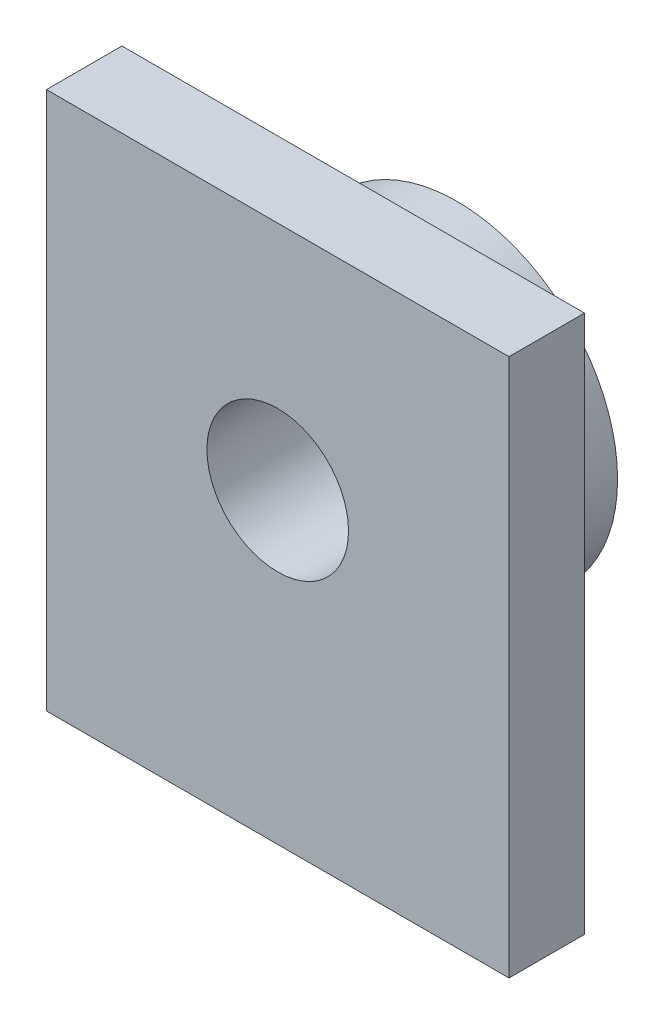
ISO-10303-21;
HEADER;
FILE_DESCRIPTION(('STEP AP214'),'2;1');
FILE_NAME('part.step','',(''),(''),'','','');
FILE_SCHEMA(('AUTOMOTIVE_DESIGN { 1 0 10303 214 1 1 1 1 }'));
ENDSEC;
DATA;
#1=APPLICATION_CONTEXT('core data for automotive mechanical design processes');
#2=APPLICATION_PROTOCOL_DEFINITION('international standard','automotive_design',2000,#1);
#3=PRODUCT_CONTEXT('',#1,'mechanical');
#4=PRODUCT('Part','Part','',(#3));
#5=PRODUCT_RELATED_PRODUCT_CATEGORY('part','',(#4));
#6=PRODUCT_DEFINITION_FORMATION('','',#4);
#7=PRODUCT_DEFINITION_CONTEXT('part definition',#1,'design');
#8=PRODUCT_DEFINITION('design','',#6,#7);
#9=PRODUCT_DEFINITION_SHAPE('','',#8);
#10=(LENGTH_UNIT() NAMED_UNIT(*) SI_UNIT(.MILLI.,.METRE.));
#11=(NAMED_UNIT(*) PLANE_ANGLE_UNIT() SI_UNIT($,.RADIAN.));
#12=(NAMED_UNIT(*) SI_UNIT($,.STERADIAN.) SOLID_ANGLE_UNIT());
#13=UNCERTAINTY_MEASURE_WITH_UNIT(LENGTH_MEASURE(1.E-05),#10,'distance_accuracy_value','');
#14=(GEOMETRIC_REPRESENTATION_CONTEXT(3) GLOBAL_UNCERTAINTY_ASSIGNED_CONTEXT((#13)) GLOBAL_UNIT_ASSIGNED_CONTEXT((#10,
#11,#12)) REPRESENTATION_CONTEXT('',''));
#15=CARTESIAN_POINT('',(0.,0.,0.));
#16=DIRECTION('',(0.,0.,1.));
#17=DIRECTION('',(1.,0.,0.));
#18=AXIS2_PLACEMENT_3D('',#15,#16,#17);
#19=CARTESIAN_POINT('',(0.,0.,1.6));
#20=DIRECTION('',(0.,0.,1.));
#21=DIRECTION('',(1.,0.,0.));
#22=AXIS2_PLACEMENT_3D('',#19,#20,#21);
#23=PLANE('',#22);
#24=DIRECTION('',(0.,-1.,0.));
#25=VECTOR('',#24,1.);
#26=CARTESIAN_POINT('',(-4.9,4.9,1.6));
#27=LINE('',#26,#25);
#28=CARTESIAN_POINT('',(-4.9,4.9,1.6));
#29=VERTEX_POINT('',#28);
#30=CARTESIAN_POINT('',(-4.9,-6.5,1.6));
#31=VERTEX_POINT('',#30);
#32=EDGE_CURVE('E89',#29,#31,#27,.T.);
#33=ORIENTED_EDGE('',*,*,#32,.T.);
#34=DIRECTION('',(1.,0.,0.));
#35=VECTOR('',#34,1.);
#36=CARTESIAN_POINT('',(-4.9,-6.5,1.6));
#37=LINE('',#36,#35);
#38=CARTESIAN_POINT('',(4.9,-6.5,1.6));
#39=VERTEX_POINT('',#38);
#40=EDGE_CURVE('E84',#31,#39,#37,.T.);
#41=ORIENTED_EDGE('',*,*,#40,.T.);
#42=DIRECTION('',(0.,1.,0.));
#43=VECTOR('',#42,1.);
#44=CARTESIAN_POINT('',(4.9,4.9,1.6));
#45=LINE('',#44,#43);
#46=CARTESIAN_POINT('',(4.9,4.9,1.6));
#47=VERTEX_POINT('',#46);
#48=EDGE_CURVE('E87',#39,#47,#45,.T.);
#49=ORIENTED_EDGE('',*,*,#48,.T.);
#50=DIRECTION('',(-1.,0.,0.));
#51=VECTOR('',#50,1.);
#52=CARTESIAN_POINT('',(-4.9,4.9,1.6));
#53=LINE('',#52,#51);
#54=EDGE_CURVE('E53',#47,#29,#53,.T.);
#55=ORIENTED_EDGE('',*,*,#54,.T.);
#56=EDGE_LOOP('',(#33,#41,#49,#55));
#57=FACE_BOUND('',#56,.T.);
#58=CARTESIAN_POINT('',(0.,0.,1.6));
#59=DIRECTION('',(0.,0.,1.));
#60=DIRECTION('',(1.,0.,0.));
#61=AXIS2_PLACEMENT_3D('',#58,#59,#60);
#62=CIRCLE('',#61,1.5);
#63=CARTESIAN_POINT('',(1.5,0.,1.6));
#64=VERTEX_POINT('',#63);
#65=EDGE_CURVE('E105',#64,#64,#62,.T.);
#66=ORIENTED_EDGE('',*,*,#65,.F.);
#67=EDGE_LOOP('',(#66));
#68=FACE_BOUND('',#67,.T.);
#69=ADVANCED_FACE('F35',(#57,#68),#23,.T.);
#70=CARTESIAN_POINT('',(0.,0.,0.));
#71=DIRECTION('',(0.,0.,1.));
#72=DIRECTION('',(1.,0.,0.));
#73=AXIS2_PLACEMENT_3D('',#70,#71,#72);
#74=PLANE('',#73);
#75=CARTESIAN_POINT('',(0.,0.,0.));
#76=DIRECTION('',(0.,0.,-1.));
#77=DIRECTION('',(-1.,0.,0.));
#78=AXIS2_PLACEMENT_3D('',#75,#76,#77);
#79=CIRCLE('',#78,3.4);
#80=CARTESIAN_POINT('',(-3.4,0.,0.));
#81=VERTEX_POINT('',#80);
#82=EDGE_CURVE('E11',#81,#81,#79,.T.);
#83=ORIENTED_EDGE('',*,*,#82,.F.);
#84=EDGE_LOOP('',(#83));
#85=FACE_BOUND('',#84,.T.);
#86=DIRECTION('',(0.,-1.,0.));
#87=VECTOR('',#86,1.);
#88=CARTESIAN_POINT('',(-4.9,4.9,0.));
#89=LINE('',#88,#87);
#90=CARTESIAN_POINT('',(-4.9,4.9,0.));
#91=VERTEX_POINT('',#90);
#92=CARTESIAN_POINT('',(-4.9,-6.5,0.));
#93=VERTEX_POINT('',#92);
#94=EDGE_CURVE('E102',#91,#93,#89,.T.);
#95=ORIENTED_EDGE('',*,*,#94,.F.);
#96=DIRECTION('',(-1.,0.,0.));
#97=VECTOR('',#96,1.);
#98=CARTESIAN_POINT('',(-4.9,4.9,0.));
#99=LINE('',#98,#97);
#100=CARTESIAN_POINT('',(4.9,4.9,0.));
#101=VERTEX_POINT('',#100);
#102=EDGE_CURVE('E76',#101,#91,#99,.T.);
#103=ORIENTED_EDGE('',*,*,#102,.F.);
#104=DIRECTION('',(0.,1.,0.));
#105=VECTOR('',#104,1.);
#106=CARTESIAN_POINT('',(4.9,4.9,0.));
#107=LINE('',#106,#105);
#108=CARTESIAN_POINT('',(4.9,-6.5,0.));
#109=VERTEX_POINT('',#108);
#110=EDGE_CURVE('E70',#109,#101,#107,.T.);
#111=ORIENTED_EDGE('',*,*,#110,.F.);
#112=DIRECTION('',(1.,0.,0.));
#113=VECTOR('',#112,1.);
#114=CARTESIAN_POINT('',(-4.9,-6.5,0.));
#115=LINE('',#114,#113);
#116=EDGE_CURVE('E94',#93,#109,#115,.T.);
#117=ORIENTED_EDGE('',*,*,#116,.F.);
#118=EDGE_LOOP('',(#95,#103,#111,#117));
#119=FACE_BOUND('',#118,.T.);
#120=ADVANCED_FACE('F113',(#85,#119),#74,.F.);
#121=CARTESIAN_POINT('',(-4.9,4.9,1.6));
#122=DIRECTION('',(1.,0.,0.));
#123=DIRECTION('',(0.,1.,0.));
#124=AXIS2_PLACEMENT_3D('',#121,#122,#123);
#125=PLANE('',#124);
#126=ORIENTED_EDGE('',*,*,#94,.T.);
#127=DIRECTION('',(0.,0.,-1.));
#128=VECTOR('',#127,1.);
#129=CARTESIAN_POINT('',(-4.9,-6.5,1.6));
#130=LINE('',#129,#128);
#131=EDGE_CURVE('E39',#31,#93,#130,.T.);
#132=ORIENTED_EDGE('',*,*,#131,.F.);
#133=ORIENTED_EDGE('',*,*,#32,.F.);
#134=DIRECTION('',(0.,0.,-1.));
#135=VECTOR('',#134,1.);
#136=CARTESIAN_POINT('',(-4.9,4.9,1.6));
#137=LINE('',#136,#135);
#138=EDGE_CURVE('E98',#29,#91,#137,.T.);
#139=ORIENTED_EDGE('',*,*,#138,.T.);
#140=EDGE_LOOP('',(#126,#132,#133,#139));
#141=FACE_BOUND('',#140,.T.);
#142=ADVANCED_FACE('F37',(#141),#125,.F.);
#143=CARTESIAN_POINT('',(-4.9,-6.5,1.6));
#144=DIRECTION('',(0.,1.,0.));
#145=DIRECTION('',(0.,0.,1.));
#146=AXIS2_PLACEMENT_3D('',#143,#144,#145);
#147=PLANE('',#146);
#148=ORIENTED_EDGE('',*,*,#116,.T.);
#149=DIRECTION('',(0.,0.,-1.));
#150=VECTOR('',#149,1.);
#151=CARTESIAN_POINT('',(4.9,-6.5,1.6));
#152=LINE('',#151,#150);
#153=EDGE_CURVE('E92',#39,#109,#152,.T.);
#154=ORIENTED_EDGE('',*,*,#153,.F.);
#155=ORIENTED_EDGE('',*,*,#40,.F.);
#156=ORIENTED_EDGE('',*,*,#131,.T.);
#157=EDGE_LOOP('',(#148,#154,#155,#156));
#158=FACE_BOUND('',#157,.T.);
#159=ADVANCED_FACE('F93',(#158),#147,.F.);
#160=CARTESIAN_POINT('',(4.9,4.9,1.6));
#161=DIRECTION('',(-1.,0.,0.));
#162=DIRECTION('',(0.,-1.,0.));
#163=AXIS2_PLACEMENT_3D('',#160,#161,#162);
#164=PLANE('',#163);
#165=ORIENTED_EDGE('',*,*,#110,.T.);
#166=DIRECTION('',(0.,0.,-1.));
#167=VECTOR('',#166,1.);
#168=CARTESIAN_POINT('',(4.9,4.9,1.6));
#169=LINE('',#168,#167);
#170=EDGE_CURVE('E95',#47,#101,#169,.T.);
#171=ORIENTED_EDGE('',*,*,#170,.F.);
#172=ORIENTED_EDGE('',*,*,#48,.F.);
#173=ORIENTED_EDGE('',*,*,#153,.T.);
#174=EDGE_LOOP('',(#165,#171,#172,#173));
#175=FACE_BOUND('',#174,.T.);
#176=ADVANCED_FACE('F96',(#175),#164,.F.);
#177=CARTESIAN_POINT('',(-4.9,4.9,1.6));
#178=DIRECTION('',(0.,-1.,0.));
#179=DIRECTION('',(0.,0.,-1.));
#180=AXIS2_PLACEMENT_3D('',#177,#178,#179);
#181=PLANE('',#180);
#182=ORIENTED_EDGE('',*,*,#102,.T.);
#183=ORIENTED_EDGE('',*,*,#138,.F.);
#184=ORIENTED_EDGE('',*,*,#54,.F.);
#185=ORIENTED_EDGE('',*,*,#170,.T.);
#186=EDGE_LOOP('',(#182,#183,#184,#185));
#187=FACE_BOUND('',#186,.T.);
#188=ADVANCED_FACE('F110',(#187),#181,.F.);
#189=CARTESIAN_POINT('',(0.,0.,1.6));
#190=DIRECTION('',(0.,0.,-1.));
#191=DIRECTION('',(-1.,0.,0.));
#192=AXIS2_PLACEMENT_3D('',#189,#190,#191);
#193=CYLINDRICAL_SURFACE('',#192,1.5);
#194=ORIENTED_EDGE('',*,*,#65,.T.);
#195=EDGE_LOOP('',(#194));
#196=FACE_BOUND('',#195,.T.);
#197=CARTESIAN_POINT('',(0.,0.,-2.2));
#198=DIRECTION('',(0.,0.,-1.));
#199=DIRECTION('',(-1.,0.,0.));
#200=AXIS2_PLACEMENT_3D('',#197,#198,#199);
#201=CIRCLE('',#200,1.5);
#202=CARTESIAN_POINT('',(-1.5,0.,-2.2));
#203=VERTEX_POINT('',#202);
#204=EDGE_CURVE('E121',#203,#203,#201,.F.);
#205=ORIENTED_EDGE('',*,*,#204,.F.);
#206=EDGE_LOOP('',(#205));
#207=FACE_BOUND('',#206,.T.);
#208=ADVANCED_FACE('F128',(#196,#207),#193,.F.);
#209=CARTESIAN_POINT('',(0.,0.,-2.2));
#210=DIRECTION('',(0.,0.,1.));
#211=DIRECTION('',(1.,0.,0.));
#212=AXIS2_PLACEMENT_3D('',#209,#210,#211);
#213=CYLINDRICAL_SURFACE('',#212,3.4);
#214=CARTESIAN_POINT('',(0.,0.,-2.2));
#215=DIRECTION('',(0.,0.,-1.));
#216=DIRECTION('',(-1.,0.,0.));
#217=AXIS2_PLACEMENT_3D('',#214,#215,#216);
#218=CIRCLE('',#217,3.4);
#219=CARTESIAN_POINT('',(-3.4,0.,-2.2));
#220=VERTEX_POINT('',#219);
#221=EDGE_CURVE('E117',#220,#220,#218,.T.);
#222=ORIENTED_EDGE('',*,*,#221,.F.);
#223=EDGE_LOOP('',(#222));
#224=FACE_BOUND('',#223,.T.);
#225=ORIENTED_EDGE('',*,*,#82,.T.);
#226=EDGE_LOOP('',(#225));
#227=FACE_BOUND('',#226,.T.);
#228=ADVANCED_FACE('F130',(#224,#227),#213,.T.);
#229=CARTESIAN_POINT('',(0.,0.,-2.2));
#230=DIRECTION('',(0.,0.,-1.));
#231=DIRECTION('',(-1.,0.,0.));
#232=AXIS2_PLACEMENT_3D('',#229,#230,#231);
#233=PLANE('',#232);
#234=ORIENTED_EDGE('',*,*,#204,.T.);
#235=EDGE_LOOP('',(#234));
#236=FACE_BOUND('',#235,.T.);
#237=ORIENTED_EDGE('',*,*,#221,.T.);
#238=EDGE_LOOP('',(#237));
#239=FACE_BOUND('',#238,.T.);
#240=ADVANCED_FACE('F125',(#236,#239),#233,.T.);
#241=CLOSED_SHELL('',(#69,#120,#142,#159,#176,#188,#208,#228,#240));
#242=MANIFOLD_SOLID_BREP('B2',#241);
#243=ADVANCED_BREP_SHAPE_REPRESENTATION('',(#18,#242),#14);
#244=SHAPE_DEFINITION_REPRESENTATION(#9,#243);
ENDSEC;
END-ISO-10303-21;
